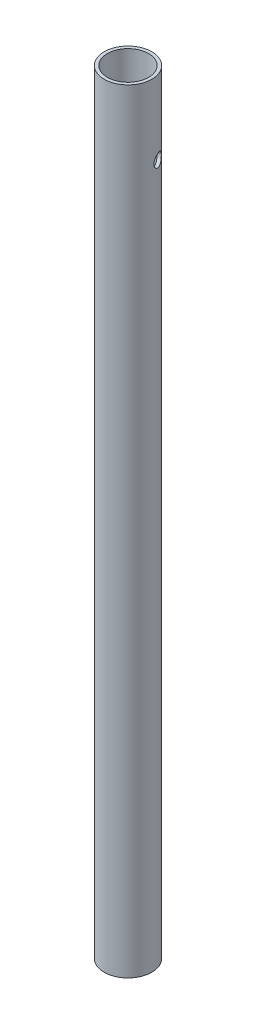
ISO-10303-21;
HEADER;
FILE_DESCRIPTION(('STEP AP214'),'2;1');
FILE_NAME('part.step','',(''),(''),'','','');
FILE_SCHEMA(('AUTOMOTIVE_DESIGN { 1 0 10303 214 1 1 1 1 }'));
ENDSEC;
DATA;
#1=APPLICATION_CONTEXT('core data for automotive mechanical design processes');
#2=APPLICATION_PROTOCOL_DEFINITION('international standard','automotive_design',2000,#1);
#3=PRODUCT_CONTEXT('',#1,'mechanical');
#4=PRODUCT('Part','Part','',(#3));
#5=PRODUCT_RELATED_PRODUCT_CATEGORY('part','',(#4));
#6=PRODUCT_DEFINITION_FORMATION('','',#4);
#7=PRODUCT_DEFINITION_CONTEXT('part definition',#1,'design');
#8=PRODUCT_DEFINITION('design','',#6,#7);
#9=PRODUCT_DEFINITION_SHAPE('','',#8);
#10=(LENGTH_UNIT() NAMED_UNIT(*) SI_UNIT(.MILLI.,.METRE.));
#11=(NAMED_UNIT(*) PLANE_ANGLE_UNIT() SI_UNIT($,.RADIAN.));
#12=(NAMED_UNIT(*) SI_UNIT($,.STERADIAN.) SOLID_ANGLE_UNIT());
#13=UNCERTAINTY_MEASURE_WITH_UNIT(LENGTH_MEASURE(1.E-05),#10,'distance_accuracy_value','');
#14=(GEOMETRIC_REPRESENTATION_CONTEXT(3) GLOBAL_UNCERTAINTY_ASSIGNED_CONTEXT((#13)) GLOBAL_UNIT_ASSIGNED_CONTEXT((#10,
#11,#12)) REPRESENTATION_CONTEXT('',''));
#15=CARTESIAN_POINT('',(0.,0.,0.));
#16=DIRECTION('',(0.,0.,1.));
#17=DIRECTION('',(1.,0.,0.));
#18=AXIS2_PLACEMENT_3D('',#15,#16,#17);
#19=CARTESIAN_POINT('',(0.,487.,0.));
#20=DIRECTION('',(0.,1.,0.));
#21=DIRECTION('',(0.,0.,1.));
#22=AXIS2_PLACEMENT_3D('',#19,#20,#21);
#23=PLANE('',#22);
#24=CARTESIAN_POINT('',(0.,487.,0.));
#25=DIRECTION('',(0.,1.,0.));
#26=DIRECTION('',(0.,0.,1.));
#27=AXIS2_PLACEMENT_3D('',#24,#25,#26);
#28=CIRCLE('',#27,15.);
#29=CARTESIAN_POINT('',(0.,487.,15.));
#30=VERTEX_POINT('',#29);
#31=EDGE_CURVE('E10',#30,#30,#28,.T.);
#32=ORIENTED_EDGE('',*,*,#31,.T.);
#33=EDGE_LOOP('',(#32));
#34=FACE_BOUND('',#33,.T.);
#35=CARTESIAN_POINT('',(0.,487.,0.));
#36=DIRECTION('',(0.,1.,0.));
#37=DIRECTION('',(0.,0.,1.));
#38=AXIS2_PLACEMENT_3D('',#35,#36,#37);
#39=CIRCLE('',#38,13.);
#40=CARTESIAN_POINT('',(0.,487.,13.));
#41=VERTEX_POINT('',#40);
#42=EDGE_CURVE('E47',#41,#41,#39,.T.);
#43=ORIENTED_EDGE('',*,*,#42,.F.);
#44=EDGE_LOOP('',(#43));
#45=FACE_BOUND('',#44,.T.);
#46=ADVANCED_FACE('F29',(#34,#45),#23,.T.);
#47=CARTESIAN_POINT('',(0.,0.,0.));
#48=DIRECTION('',(0.,1.,0.));
#49=DIRECTION('',(0.,0.,1.));
#50=AXIS2_PLACEMENT_3D('',#47,#48,#49);
#51=PLANE('',#50);
#52=CARTESIAN_POINT('',(0.,0.,0.));
#53=DIRECTION('',(0.,1.,0.));
#54=DIRECTION('',(0.,0.,1.));
#55=AXIS2_PLACEMENT_3D('',#52,#53,#54);
#56=CIRCLE('',#55,15.);
#57=CARTESIAN_POINT('',(0.,0.,15.));
#58=VERTEX_POINT('',#57);
#59=EDGE_CURVE('E42',#58,#58,#56,.T.);
#60=ORIENTED_EDGE('',*,*,#59,.F.);
#61=EDGE_LOOP('',(#60));
#62=FACE_BOUND('',#61,.T.);
#63=CARTESIAN_POINT('',(0.,0.,0.));
#64=DIRECTION('',(0.,1.,0.));
#65=DIRECTION('',(0.,0.,1.));
#66=AXIS2_PLACEMENT_3D('',#63,#64,#65);
#67=CIRCLE('',#66,13.);
#68=CARTESIAN_POINT('',(0.,0.,13.));
#69=VERTEX_POINT('',#68);
#70=EDGE_CURVE('E50',#69,#69,#67,.T.);
#71=ORIENTED_EDGE('',*,*,#70,.T.);
#72=EDGE_LOOP('',(#71));
#73=FACE_BOUND('',#72,.T.);
#74=ADVANCED_FACE('F83',(#62,#73),#51,.F.);
#75=CARTESIAN_POINT('',(0.,487.,0.));
#76=DIRECTION('',(0.,-1.,0.));
#77=DIRECTION('',(0.,0.,-1.));
#78=AXIS2_PLACEMENT_3D('',#75,#76,#77);
#79=CYLINDRICAL_SURFACE('',#78,15.);
#80=CARTESIAN_POINT('',(14.9376362524135,440.,-1.36639057029147));
#81=CARTESIAN_POINT('',(14.9376379475852,440.220351875481,-1.36639689069312));
#82=CARTESIAN_POINT('',(14.9359449105597,440.440760000953,-1.38528172759662));
#83=CARTESIAN_POINT('',(14.9288208500478,440.875210843114,-1.46002423433184));
#84=CARTESIAN_POINT('',(14.9233879511616,441.089250309958,-1.51590045340969));
#85=CARTESIAN_POINT('',(14.9077969595835,441.504616139895,-1.66221328734155));
#86=CARTESIAN_POINT('',(14.8976455068376,441.705959917659,-1.75260130540072));
#87=CARTESIAN_POINT('',(14.8711758142155,442.091033480122,-1.96455851840169));
#88=CARTESIAN_POINT('',(14.8548570952472,442.274761895017,-2.08613013554408));
#89=CARTESIAN_POINT('',(14.8139293232583,442.623985093979,-2.35944291881223));
#90=CARTESIAN_POINT('',(14.7891412658556,442.788974034932,-2.51180375023744));
#91=CARTESIAN_POINT('',(14.7296345610665,443.091563153906,-2.84000656767178));
#92=CARTESIAN_POINT('',(14.6949148849951,443.229160492288,-3.01585098502857));
#93=CARTESIAN_POINT('',(14.6134904616721,443.47516987681,-3.38863052127583));
#94=CARTESIAN_POINT('',(14.566602616199,443.58307903727,-3.58585839558687));
#95=CARTESIAN_POINT('',(14.4603485914372,443.763369270739,-3.99280267511343));
#96=CARTESIAN_POINT('',(14.4009845186843,443.835756334568,-4.20251696779378));
#97=CARTESIAN_POINT('',(14.2715240451911,443.941310440477,-4.62286003821469));
#98=CARTESIAN_POINT('',(14.2017046555378,443.975337953257,-4.83335781220347));
#99=CARTESIAN_POINT('',(14.0517497041047,444.00591424022,-5.25338183741455));
#100=CARTESIAN_POINT('',(13.9716158711744,444.002469287266,-5.46290824536806));
#101=CARTESIAN_POINT('',(13.805642100927,443.958804374926,-5.86952171559844));
#102=CARTESIAN_POINT('',(13.7199970438229,443.919514084733,-6.06678922986318));
#103=CARTESIAN_POINT('',(13.5444164968208,443.806775724441,-6.44927062511435));
#104=CARTESIAN_POINT('',(13.4544807625407,443.733325706633,-6.63448381810409));
#105=CARTESIAN_POINT('',(13.2731598803016,443.55364030482,-6.99024481586594));
#106=CARTESIAN_POINT('',(13.1817692101257,443.447086385804,-7.16062860223872));
#107=CARTESIAN_POINT('',(13.0025882296117,443.204462360986,-7.48107298927626));
#108=CARTESIAN_POINT('',(12.9147986250204,443.068386501946,-7.63112961931111));
#109=CARTESIAN_POINT('',(12.7445425339747,442.765646284138,-7.91230109278182));
#110=CARTESIAN_POINT('',(12.6623222074221,442.598171109913,-8.04269299820274));
#111=CARTESIAN_POINT('',(12.5109005937783,442.239950647518,-8.27627920651759));
#112=CARTESIAN_POINT('',(12.4417001005501,442.049203941572,-8.37947185113501));
#113=CARTESIAN_POINT('',(12.3202266272456,441.648199796383,-8.55708582270042));
#114=CARTESIAN_POINT('',(12.2680606612589,441.437829298274,-8.63132580872717));
#115=CARTESIAN_POINT('',(12.1848677135477,441.004547001194,-8.74838344854573));
#116=CARTESIAN_POINT('',(12.1538354896785,440.781638327132,-8.79120889479843));
#117=CARTESIAN_POINT('',(12.1157874629629,440.336745577922,-8.84356930622375));
#118=CARTESIAN_POINT('',(12.1080817359527,440.114932902752,-8.85406078286354));
#119=CARTESIAN_POINT('',(12.11528800144,439.672380454389,-8.84419784800806));
#120=CARTESIAN_POINT('',(12.130197586869,439.451640569521,-8.82384671925615));
#121=CARTESIAN_POINT('',(12.1810460040586,439.021886811815,-8.75350909669322));
#122=CARTESIAN_POINT('',(12.2165752521451,438.812729124124,-8.70409956298651));
#123=CARTESIAN_POINT('',(12.3059745159262,438.407240737279,-8.57723582875527));
#124=CARTESIAN_POINT('',(12.3598469266703,438.210911717143,-8.49977796590275));
#125=CARTESIAN_POINT('',(12.4839946638457,437.831890085127,-8.31639100352773));
#126=CARTESIAN_POINT('',(12.554604497085,437.649592048218,-8.20987353201583));
#127=CARTESIAN_POINT('',(12.7074580086047,437.308073396591,-7.9712326709441));
#128=CARTESIAN_POINT('',(12.7897038731658,437.148857130088,-7.83910446768276));
#129=CARTESIAN_POINT('',(12.9639603774017,436.853295053496,-7.54753902088796));
#130=CARTESIAN_POINT('',(13.0561845370422,436.717743246039,-7.38742285953389));
#131=CARTESIAN_POINT('',(13.2435406955314,436.479178025175,-7.04602623300473));
#132=CARTESIAN_POINT('',(13.338672539308,436.376162879838,-6.86474689505173));
#133=CARTESIAN_POINT('',(13.5265215292037,436.206540735272,-6.48670811671682));
#134=CARTESIAN_POINT('',(13.6192515605767,436.139661961108,-6.29007733151613));
#135=CARTESIAN_POINT('',(13.7989692656451,436.043422543866,-5.88535558715236));
#136=CARTESIAN_POINT('',(13.8859582078421,436.014053586445,-5.67726717833139));
#137=CARTESIAN_POINT('',(14.0483921733182,435.994188352512,-5.26220791809684));
#138=CARTESIAN_POINT('',(14.1241094417985,436.002527361732,-5.05539856546836));
#139=CARTESIAN_POINT('',(14.2650608269379,436.055136987145,-4.64279773353804));
#140=CARTESIAN_POINT('',(14.3302953370931,436.099406254229,-4.43700621631044));
#141=CARTESIAN_POINT('',(14.4489106573758,436.221961209832,-4.03396207603864));
#142=CARTESIAN_POINT('',(14.5023699910164,436.30001058694,-3.83666041626762));
#143=CARTESIAN_POINT('',(14.5980585733438,436.487699203487,-3.45477684897772));
#144=CARTESIAN_POINT('',(14.6402862454788,436.597342873221,-3.27019672983145));
#145=CARTESIAN_POINT('',(14.7153195074144,436.848516544269,-2.91433523419844));
#146=CARTESIAN_POINT('',(14.7478438658137,436.990818761393,-2.7435396433636));
#147=CARTESIAN_POINT('',(14.8033866532686,437.301805498726,-2.42606138943716));
#148=CARTESIAN_POINT('',(14.8264025785683,437.470496951635,-2.27938508353642));
#149=CARTESIAN_POINT('',(14.8650801483114,437.833936791632,-2.01198580386249));
#150=CARTESIAN_POINT('',(14.8805689294883,438.029176627311,-1.89190452120568));
#151=CARTESIAN_POINT('',(14.9052596257943,438.437412621718,-1.68642150836445));
#152=CARTESIAN_POINT('',(14.9144656553813,438.650397057076,-1.60099709693151));
#153=CARTESIAN_POINT('',(14.9269966197292,439.052162672101,-1.47914210506031));
#154=CARTESIAN_POINT('',(14.9310373313106,439.239202529112,-1.43698230416531));
#155=CARTESIAN_POINT('',(14.9363562543976,439.617481115987,-1.38060538653264));
#156=CARTESIAN_POINT('',(14.9376347808875,439.808719364577,-1.36638508374664));
#157=CARTESIAN_POINT('',(14.9376362524135,440.,-1.36639057029147));
#158=B_SPLINE_CURVE_WITH_KNOTS('',3,(#80,#81,#82,#83,#84,#85,#86,#87,#88,#89,#90,#91,#92,#93,
#94,#95,#96,#97,#98,#99,#100,#101,#102,#103,#104,#105,#106,#107,#108,#109,#110,#111,#112,#113,
#114,#115,#116,#117,#118,#119,#120,#121,#122,#123,#124,#125,#126,#127,#128,#129,#130,#131,#132,
#133,#134,#135,#136,#137,#138,#139,#140,#141,#142,#143,#144,#145,#146,#147,#148,#149,#150,#151,
#152,#153,#154,#155,#156,#157),.UNSPECIFIED.,.T.,.F.,(4,2,2,2,2,2,2,2,2,2,2,2,2,2,2,2,2,2,2,2,2,
2,2,2,2,2,2,2,2,2,2,2,2,2,2,2,2,2,4),(0.,0.660352256232896,1.32103589570211,1.98079262319479,
2.64060061312546,3.31531832260848,3.99010594249442,4.67570414742218,5.36118668609198,
6.03096608633756,6.7006333677209,7.35341141602572,8.00622668882437,8.66552897812272,
9.32495986790195,10.0046352460197,10.6843520528055,11.3682603019684,12.0519988484352,
12.7153066849063,13.3785439269368,14.029037008719,14.6796150573648,15.3444926994246,
16.0094954308996,16.6937181392637,17.377904420234,18.0568707919009,18.7356866392539,
19.3936810984039,20.0516508523347,20.7050902974496,21.3586214153964,22.0295770799096,
22.7007093076998,23.3866007797913,24.0720426421069,24.6453393535126,25.218570685896),.UNSPECIFIED.);
#159=CARTESIAN_POINT('',(14.9376362524135,440.,-1.36639057029147));
#160=VERTEX_POINT('',#159);
#161=EDGE_CURVE('E73',#160,#160,#158,.T.);
#162=ORIENTED_EDGE('',*,*,#161,.T.);
#163=EDGE_LOOP('',(#162));
#164=FACE_BOUND('',#163,.T.);
#165=CARTESIAN_POINT('',(-12.1108193872136,440.,8.85031376677065));
#166=CARTESIAN_POINT('',(-12.1108248375872,439.779648124519,8.85031014537423));
#167=CARTESIAN_POINT('',(-12.1220396271537,439.559239999047,8.83502185134835));
#168=CARTESIAN_POINT('',(-12.1661079475013,439.124789156886,8.77423387808899));
#169=CARTESIAN_POINT('',(-12.1989723343839,438.910749690042,8.72871904178727));
#170=CARTESIAN_POINT('',(-12.2840042645092,438.495383860104,8.60863534076694));
#171=CARTESIAN_POINT('',(-12.3361446615305,438.294040082341,8.53410732724197));
#172=CARTESIAN_POINT('',(-12.4564129543661,437.908966519878,8.35757958860284));
#173=CARTESIAN_POINT('',(-12.5245420920784,437.725238104983,8.25557772941411));
#174=CARTESIAN_POINT('',(-12.6745257994071,437.376014906021,8.02345739951234));
#175=CARTESIAN_POINT('',(-12.7566557348272,437.211025965068,7.89275566099956));
#176=CARTESIAN_POINT('',(-12.9289885809186,436.908436846094,7.60716937378548));
#177=CARTESIAN_POINT('',(-13.0191923271838,436.770839507712,7.45228232080244));
#178=CARTESIAN_POINT('',(-13.2045509850221,436.52483012319,7.11876067634352));
#179=CARTESIAN_POINT('',(-13.2997620658265,436.41692096273,6.93978538600869));
#180=CARTESIAN_POINT('',(-13.4890782812772,436.236630729261,6.56421523945164));
#181=CARTESIAN_POINT('',(-13.5831835997961,436.164243665432,6.36762336089437));
#182=CARTESIAN_POINT('',(-13.7639465164872,436.058689559523,5.96665817662357));
#183=CARTESIAN_POINT('',(-13.8507253432585,436.024662046743,5.76256629719182));
#184=CARTESIAN_POINT('',(-14.0159006436947,435.99408575978,5.34829128063925));
#185=CARTESIAN_POINT('',(-14.0942985181063,435.997530712734,5.13810916889388));
#186=CARTESIAN_POINT('',(-14.2385892266853,436.041195625074,4.72330560333457));
#187=CARTESIAN_POINT('',(-14.3047475759883,436.080485915267,4.51867759741149));
#188=CARTESIAN_POINT('',(-14.4258763911663,436.193224275559,4.1156287711728));
#189=CARTESIAN_POINT('',(-14.4808462188401,436.266674293367,3.9172083054857));
#190=CARTESIAN_POINT('',(-14.5800028931878,436.44635969518,3.53041235954421));
#191=CARTESIAN_POINT('',(-14.6240771616019,436.552913614196,3.34215628894439));
#192=CARTESIAN_POINT('',(-14.701491029766,436.795537639014,2.98327257243208));
#193=CARTESIAN_POINT('',(-14.7348285339839,436.931613498054,2.81264837220177));
#194=CARTESIAN_POINT('',(-14.7929746964199,437.234353715862,2.48913089535423));
#195=CARTESIAN_POINT('',(-14.8174900994426,437.401828890087,2.33694276798435));
#196=CARTESIAN_POINT('',(-14.8583081467238,437.760049352482,2.0615795373061));
#197=CARTESIAN_POINT('',(-14.8746102902939,437.950796058428,1.93840620301174));
#198=CARTESIAN_POINT('',(-14.9008938794914,438.351800203617,1.72483724330369));
#199=CARTESIAN_POINT('',(-14.9108357289346,438.562170701726,1.63464842380687));
#200=CARTESIAN_POINT('',(-14.9258059061716,438.995452998806,1.49182177579514));
#201=CARTESIAN_POINT('',(-14.9308354525781,439.218361672868,1.43917463505652));
#202=CARTESIAN_POINT('',(-14.9369048589176,439.663254422078,1.37473530445581));
#203=CARTESIAN_POINT('',(-14.9380594434803,439.885067097248,1.36176933957359));
#204=CARTESIAN_POINT('',(-14.9369456590487,440.327619545611,1.37393351774051));
#205=CARTESIAN_POINT('',(-14.934677654339,440.548359430479,1.39905960644886));
#206=CARTESIAN_POINT('',(-14.9263271794152,440.978113188185,1.48544949154566));
#207=CARTESIAN_POINT('',(-14.9203188418732,441.187270875876,1.54600962175266));
#208=CARTESIAN_POINT('',(-14.9035222116504,441.592759262721,1.70029671985504));
#209=CARTESIAN_POINT('',(-14.8927332947186,441.789088282857,1.79402801894184));
#210=CARTESIAN_POINT('',(-14.8646395535788,442.168109914873,2.01369636059282));
#211=CARTESIAN_POINT('',(-14.8471967231159,442.350407951782,2.1402959970568));
#212=CARTESIAN_POINT('',(-14.8041112999182,442.691926603409,2.42039830491026));
#213=CARTESIAN_POINT('',(-14.7784671651058,442.851142869912,2.57390603332868));
#214=CARTESIAN_POINT('',(-14.7164508392066,443.146704946504,2.90786668124263));
#215=CARTESIAN_POINT('',(-14.6797900060952,443.282256753961,3.08897014356113));
#216=CARTESIAN_POINT('',(-14.5946580078523,443.520821974825,3.46897873504889));
#217=CARTESIAN_POINT('',(-14.5461874715961,443.623837120162,3.66788291596031));
#218=CARTESIAN_POINT('',(-14.4372005606101,443.793459264728,4.07570936699493));
#219=CARTESIAN_POINT('',(-14.376778909359,443.860338038892,4.28454362775495));
#220=CARTESIAN_POINT('',(-14.2440507114451,443.956577456134,4.7070141821779));
#221=CARTESIAN_POINT('',(-14.171746802589,443.985946413555,4.92064940098401));
#222=CARTESIAN_POINT('',(-14.0192165945501,444.005811647488,5.33944949444427));
#223=CARTESIAN_POINT('',(-13.9393013260133,443.997472638268,5.54467318443989));
#224=CARTESIAN_POINT('',(-13.7722783731614,443.944863012855,5.94742630075674));
#225=CARTESIAN_POINT('',(-13.6851709590073,443.900593745771,6.14495601567936));
#226=CARTESIAN_POINT('',(-13.5077076735181,443.778038790168,6.52577218591982));
#227=CARTESIAN_POINT('',(-13.4173782982478,443.69998941306,6.70914734581056));
#228=CARTESIAN_POINT('',(-13.2367030073198,443.512300796513,7.05892985395241));
#229=CARTESIAN_POINT('',(-13.1463570911196,443.402657126779,7.22533481813297));
#230=CARTESIAN_POINT('',(-12.9673880140583,443.151483455731,7.54193782495176));
#231=CARTESIAN_POINT('',(-12.8788750098006,443.009181238607,7.69158546380779));
#232=CARTESIAN_POINT('',(-12.7106582675827,442.698194501274,7.96650467119797));
#233=CARTESIAN_POINT('',(-12.6309568539274,442.529503048365,8.09176981475926));
#234=CARTESIAN_POINT('',(-12.4831943605482,442.166063208368,8.31796569164861));
#235=CARTESIAN_POINT('',(-12.4154278158105,441.970823372689,8.41830069152976));
#236=CARTESIAN_POINT('',(-12.2981049603805,441.562587378282,8.58879481648468));
#237=CARTESIAN_POINT('',(-12.2485367417887,441.349602942924,8.65897367907915));
#238=CARTESIAN_POINT('',(-12.177378366923,440.947837327899,8.75868400852348));
#239=CARTESIAN_POINT('',(-12.1525375733193,440.760797470888,8.79298723191032));
#240=CARTESIAN_POINT('',(-12.1192566528227,440.382518884013,8.83880238350306));
#241=CARTESIAN_POINT('',(-12.1108146559132,440.191280635423,8.85031691039269));
#242=CARTESIAN_POINT('',(-12.1108193872136,440.,8.85031376677065));
#243=B_SPLINE_CURVE_WITH_KNOTS('',3,(#165,#166,#167,#168,#169,#170,#171,#172,#173,#174,#175,
#176,#177,#178,#179,#180,#181,#182,#183,#184,#185,#186,#187,#188,#189,#190,#191,#192,#193,#194,
#195,#196,#197,#198,#199,#200,#201,#202,#203,#204,#205,#206,#207,#208,#209,#210,#211,#212,#213,
#214,#215,#216,#217,#218,#219,#220,#221,#222,#223,#224,#225,#226,#227,#228,#229,#230,#231,#232,
#233,#234,#235,#236,#237,#238,#239,#240,#241,#242),.UNSPECIFIED.,.T.,.F.,(4,2,2,2,2,2,2,2,2,2,2,
2,2,2,2,2,2,2,2,2,2,2,2,2,2,2,2,2,2,2,2,2,2,2,2,2,2,2,4),(0.,0.660352256232896,1.32103589570211,
1.98079262319486,2.64060061312546,3.31531832260847,3.99010594249441,4.67570414742216,
5.36118668609196,6.03096608633755,6.70063336772089,7.35341141602571,8.00622668882437,
8.66552897812274,9.32495986790197,10.0046352460196,10.6843520528056,11.3682603019685,
12.0519988484352,12.7153066849063,13.3785439269369,14.029037008719,14.6796150573648,
15.3444926994247,16.0094954308995,16.6937181392637,17.377904420234,18.0568707919009,
18.7356866392539,19.3936810984039,20.0516508523347,20.7050902974496,21.3586214153964,
22.0295770799095,22.7007093076998,23.3866007797913,24.0720426421069,24.6453393535126,
25.218570685896),.UNSPECIFIED.);
#244=CARTESIAN_POINT('',(-12.1108193872136,440.,8.85031376677065));
#245=VERTEX_POINT('',#244);
#246=EDGE_CURVE('E69',#245,#245,#243,.T.);
#247=ORIENTED_EDGE('',*,*,#246,.T.);
#248=EDGE_LOOP('',(#247));
#249=FACE_BOUND('',#248,.T.);
#250=ORIENTED_EDGE('',*,*,#31,.F.);
#251=EDGE_LOOP('',(#250));
#252=FACE_BOUND('',#251,.T.);
#253=ORIENTED_EDGE('',*,*,#59,.T.);
#254=EDGE_LOOP('',(#253));
#255=FACE_BOUND('',#254,.T.);
#256=ADVANCED_FACE('F31',(#164,#249,#252,#255),#79,.T.);
#257=CARTESIAN_POINT('',(0.,487.,0.));
#258=DIRECTION('',(0.,-1.,0.));
#259=DIRECTION('',(0.,0.,-1.));
#260=AXIS2_PLACEMENT_3D('',#257,#258,#259);
#261=CYLINDRICAL_SURFACE('',#260,13.);
#262=CARTESIAN_POINT('',(12.9847856199924,440.,-0.628762596564893));
#263=CARTESIAN_POINT('',(12.9847865357193,440.218895633333,-0.628765059934831));
#264=CARTESIAN_POINT('',(12.9839101572565,440.437810969678,-0.647704465699338));
#265=CARTESIAN_POINT('',(12.9799559600609,440.869222363371,-0.722571498832685));
#266=CARTESIAN_POINT('',(12.9768774922975,441.081716508927,-0.778510030737926));
#267=CARTESIAN_POINT('',(12.9672712468072,441.49397561595,-0.924765162043783));
#268=CARTESIAN_POINT('',(12.9607494221174,441.693761881519,-1.01502235460628));
#269=CARTESIAN_POINT('',(12.9424556772616,442.0759997018,-1.2263980821186));
#270=CARTESIAN_POINT('',(12.930682883656,442.258448366471,-1.34752174992253));
#271=CARTESIAN_POINT('',(12.8993455064339,442.606907138947,-1.62058325015506));
#272=CARTESIAN_POINT('',(12.8795564628196,442.772254846988,-1.7733408197187));
#273=CARTESIAN_POINT('',(12.8299568704235,443.075907436171,-2.10234288247162));
#274=CARTESIAN_POINT('',(12.8001449677861,443.214208659968,-2.27859054668521));
#275=CARTESIAN_POINT('',(12.7278092618534,443.462747276003,-2.65330232558785));
#276=CARTESIAN_POINT('',(12.6850218328135,443.57230513571,-2.85216785689052));
#277=CARTESIAN_POINT('',(12.5857232504792,443.755777884024,-3.26252289425673));
#278=CARTESIAN_POINT('',(12.529215223441,443.829700880642,-3.47400951632088));
#279=CARTESIAN_POINT('',(12.4042777845987,443.93760142923,-3.89626673629182));
#280=CARTESIAN_POINT('',(12.3362567592854,443.972710553449,-4.1068685647495));
#281=CARTESIAN_POINT('',(12.1884129705305,444.005569212859,-4.52681979322199));
#282=CARTESIAN_POINT('',(12.1085928142587,444.003326989117,-4.73616945931253));
#283=CARTESIAN_POINT('',(11.9424933856763,443.962296890549,-5.14033318257637));
#284=CARTESIAN_POINT('',(11.8565198722113,443.924735190602,-5.33539923131212));
#285=CARTESIAN_POINT('',(11.679105690288,443.816140819171,-5.71332600693837));
#286=CARTESIAN_POINT('',(11.5876646694081,443.745105988059,-5.8961859454429));
#287=CARTESIAN_POINT('',(11.4020673206389,443.570777513168,-6.2476285119374));
#288=CARTESIAN_POINT('',(11.3078915685701,443.467106521841,-6.41601319268988));
#289=CARTESIAN_POINT('',(11.1222385741349,443.230749615193,-6.73272293711116));
#290=CARTESIAN_POINT('',(11.030762004363,443.098056536164,-6.88104303345486));
#291=CARTESIAN_POINT('',(10.8514667024599,442.801101778667,-7.1606133017155));
#292=CARTESIAN_POINT('',(10.7639457278772,442.635780029855,-7.29092998799221));
#293=CARTESIAN_POINT('',(10.601790685472,442.281512121346,-7.52478152141271));
#294=CARTESIAN_POINT('',(10.5271580409026,442.092563356494,-7.62831341135024));
#295=CARTESIAN_POINT('',(10.3949127917656,441.693713863552,-7.80758483264644));
#296=CARTESIAN_POINT('',(10.3374880029466,441.483613170598,-7.88301971585709));
#297=CARTESIAN_POINT('',(10.2450268694745,441.050062565505,-8.00282560250831));
#298=CARTESIAN_POINT('',(10.2099827714318,440.82661730572,-8.04720736425678));
#299=CARTESIAN_POINT('',(10.1660075802126,440.382070943657,-8.1026848488532));
#300=CARTESIAN_POINT('',(10.1561102048861,440.161219039526,-8.11501272404822));
#301=CARTESIAN_POINT('',(10.1604043369788,439.720137228088,-8.10963632819492));
#302=CARTESIAN_POINT('',(10.174592260326,439.499907233121,-8.0919365254892));
#303=CARTESIAN_POINT('',(10.2251978677875,439.072674790519,-8.02788254583139));
#304=CARTESIAN_POINT('',(10.2609875461418,438.865474860405,-7.98233742078781));
#305=CARTESIAN_POINT('',(10.3517092387452,438.463306235823,-7.86432567590884));
#306=CARTESIAN_POINT('',(10.406644311291,438.268339501367,-7.79185475480857));
#307=CARTESIAN_POINT('',(10.5338868243481,437.890138176735,-7.61899084416436));
#308=CARTESIAN_POINT('',(10.6066372149478,437.707384295718,-7.51787353347473));
#309=CARTESIAN_POINT('',(10.7642385187518,437.364112908895,-7.29042381499363));
#310=CARTESIAN_POINT('',(10.8490924782512,437.203601021191,-7.16408505611645));
#311=CARTESIAN_POINT('',(11.0298176271335,436.902750842723,-6.88274132160719));
#312=CARTESIAN_POINT('',(11.1259937124394,436.763476104594,-6.72679195752656));
#313=CARTESIAN_POINT('',(11.3211864223107,436.517051927709,-6.39281565890872));
#314=CARTESIAN_POINT('',(11.4202029117726,436.409900963757,-6.21478977310453));
#315=CARTESIAN_POINT('',(11.6153062257859,436.231797793996,-5.84196443282183));
#316=CARTESIAN_POINT('',(11.7114094701682,436.160579716791,-5.64730102340928));
#317=CARTESIAN_POINT('',(11.896960614627,436.055716468484,-5.24512120452848));
#318=CARTESIAN_POINT('',(11.9864105199077,436.022059933792,-5.03760870239292));
#319=CARTESIAN_POINT('',(12.1516392807925,435.994175498761,-4.62441144911146));
#320=CARTESIAN_POINT('',(12.2278245549821,435.998409017627,-4.41899179337117));
#321=CARTESIAN_POINT('',(12.3686250684546,436.042480395005,-4.00802819731529));
#322=CARTESIAN_POINT('',(12.4332410229329,436.082316051741,-3.80248426547096));
#323=CARTESIAN_POINT('',(12.5492818655035,436.195491624482,-3.3998455759463));
#324=CARTESIAN_POINT('',(12.6008534619116,436.268430493348,-3.20267972226464));
#325=CARTESIAN_POINT('',(12.6920093488492,436.445381267962,-2.81986881287942));
#326=CARTESIAN_POINT('',(12.7315916125904,436.549398421575,-2.6342257093015));
#327=CARTESIAN_POINT('',(12.8009728421308,436.789549472631,-2.27374639582321));
#328=CARTESIAN_POINT('',(12.8304035340174,436.926634667593,-2.0994732984794));
#329=CARTESIAN_POINT('',(12.8794584377938,437.227338979039,-1.77389699399997));
#330=CARTESIAN_POINT('',(12.8990797516012,437.390965918127,-1.62260058427698));
#331=CARTESIAN_POINT('',(12.9311899561883,437.746353952262,-1.34340494148787));
#332=CARTESIAN_POINT('',(12.9434319752111,437.938844710166,-1.21640359795819));
#333=CARTESIAN_POINT('',(12.9621957814591,438.342781506824,-0.996840733054924));
#334=CARTESIAN_POINT('',(12.9687200557352,438.554219260036,-0.90426424797802));
#335=CARTESIAN_POINT('',(12.9776762285199,438.969576396424,-0.764437547311014));
#336=CARTESIAN_POINT('',(12.9804353058348,439.172332622421,-0.713743265554671));
#337=CARTESIAN_POINT('',(12.9839893422483,439.583387466025,-0.645908437612331));
#338=CARTESIAN_POINT('',(12.9847847485276,439.791684810846,-0.628760252263333));
#339=CARTESIAN_POINT('',(12.9847856199924,440.,-0.628762596564893));
#340=B_SPLINE_CURVE_WITH_KNOTS('',3,(#262,#263,#264,#265,#266,#267,#268,#269,#270,#271,#272,
#273,#274,#275,#276,#277,#278,#279,#280,#281,#282,#283,#284,#285,#286,#287,#288,#289,#290,#291,
#292,#293,#294,#295,#296,#297,#298,#299,#300,#301,#302,#303,#304,#305,#306,#307,#308,#309,#310,
#311,#312,#313,#314,#315,#316,#317,#318,#319,#320,#321,#322,#323,#324,#325,#326,#327,#328,#329,
#330,#331,#332,#333,#334,#335,#336,#337,#338,#339),.UNSPECIFIED.,.T.,.F.,(4,2,2,2,2,2,2,2,2,2,2,
2,2,2,2,2,2,2,2,2,2,2,2,2,2,2,2,2,2,2,2,2,2,2,2,2,2,2,4),(0.,0.655917809649885,1.3120290203163,
1.967009611655,2.62209919231317,3.29696185742468,3.97191571746745,4.66162344768767,
5.35117417432776,6.02004343553606,6.68876512178488,7.33509594401607,7.98146847208715,
8.63560743090418,9.28990803760375,9.97068242960502,10.6515319512413,11.3395625139908,
12.0273545913861,12.6882881485736,13.3491233625412,13.9916145334807,14.6342083834176,
15.2947765635335,15.9555112935248,16.6426712045207,17.3297984848591,18.0117642066852,
18.6935235556845,19.3477287428133,20.0018934741331,20.6483362097528,21.2948881651586,
21.9628972721022,22.6311036191777,23.320576376814,24.0097490850114,24.6341049322677,
25.2583185837973),.UNSPECIFIED.);
#341=CARTESIAN_POINT('',(12.9847856199924,440.,-0.628762596564893));
#342=VERTEX_POINT('',#341);
#343=EDGE_CURVE('E34',#342,#342,#340,.T.);
#344=ORIENTED_EDGE('',*,*,#343,.F.);
#345=EDGE_LOOP('',(#344));
#346=FACE_BOUND('',#345,.T.);
#347=CARTESIAN_POINT('',(-10.1579687547925,440.,8.11268579304407));
#348=CARTESIAN_POINT('',(-10.1579710704191,439.781104366667,8.11268455021642));
#349=CARTESIAN_POINT('',(-10.1698346626016,439.562189030323,8.09789521924941));
#350=CARTESIAN_POINT('',(-10.2163636087722,439.130777636629,8.03910945997135));
#351=CARTESIAN_POINT('',(-10.2510356849554,438.918283491073,7.99510442107087));
#352=CARTESIAN_POINT('',(-10.3405197296855,438.50602438405,7.8790206189086));
#353=CARTESIAN_POINT('',(-10.3952968899519,438.306238118481,7.8069903633232));
#354=CARTESIAN_POINT('',(-10.521315041501,437.9240002982,7.6363041460637));
#355=CARTESIAN_POINT('',(-10.5925587708622,437.741551633529,7.53764375584423));
#356=CARTESIAN_POINT('',(-10.7495718764693,437.393092861053,7.31205231365719));
#357=CARTESIAN_POINT('',(-10.8357147843649,437.227745153012,7.18435783168771));
#358=CARTESIAN_POINT('',(-11.0160091771475,436.924092563829,6.90472162374477));
#359=CARTESIAN_POINT('',(-11.1101617426692,436.785791340032,6.7527766235464));
#360=CARTESIAN_POINT('',(-11.3036169595967,436.537252723997,6.42381393471272));
#361=CARTESIAN_POINT('',(-11.4029871992212,436.42769486429,6.2463207824473));
#362=CARTESIAN_POINT('',(-11.599776879042,436.244222115976,5.8727899442807));
#363=CARTESIAN_POINT('',(-11.6971967581649,436.170299119358,5.67675648901468));
#364=CARTESIAN_POINT('',(-11.8826187109865,436.06239857077,5.27734539395862));
#365=CARTESIAN_POINT('',(-11.9708156147541,436.027289446551,5.07436436972188));
#366=CARTESIAN_POINT('',(-12.1375267609673,435.994430787141,4.66153969277383));
#367=CARTESIAN_POINT('',(-12.2160431354388,435.996673010883,4.45169756406913));
#368=CARTESIAN_POINT('',(-12.3586200000179,436.037703109451,4.03864893126099));
#369=CARTESIAN_POINT('',(-12.4230764916752,436.075264809398,3.83545550353726));
#370=CARTESIAN_POINT('',(-12.5398184314576,436.183859180829,3.43461169458092));
#371=CARTESIAN_POINT('',(-12.5921030939524,436.254894011941,3.23696167187095));
#372=CARTESIAN_POINT('',(-12.6851962216966,436.429222486832,2.8505785420876));
#373=CARTESIAN_POINT('',(-12.7258592473939,436.532893478159,2.66198111015656));
#374=CARTESIAN_POINT('',(-12.7959482350521,436.769250384807,2.30162069284743));
#375=CARTESIAN_POINT('',(-12.8253714176772,436.901943463836,2.12986187903909));
#376=CARTESIAN_POINT('',(-12.8756770188358,437.198898221333,1.80156980378918));
#377=CARTESIAN_POINT('',(-12.896165698897,437.364219970145,1.64593377420925));
#378=CARTESIAN_POINT('',(-12.9291060305478,437.718487878654,1.36327544333734));
#379=CARTESIAN_POINT('',(-12.9415567949288,437.907436643506,1.23625630172556));
#380=CARTESIAN_POINT('',(-12.9608542517651,438.306286136448,1.01432240036637));
#381=CARTESIAN_POINT('',(-12.9676404520161,438.516386829402,0.919760381235718));
#382=CARTESIAN_POINT('',(-12.9774737596668,438.949937434495,0.768744429297286));
#383=CARTESIAN_POINT('',(-12.9805221622967,439.17338269428,0.712277298814728));
#384=CARTESIAN_POINT('',(-12.9842052523934,439.617929056343,0.64158073887547));
#385=CARTESIAN_POINT('',(-12.9849295476785,439.838780960474,0.625788020885281));
#386=CARTESIAN_POINT('',(-12.9845969527555,440.279862771912,0.6326607629449));
#387=CARTESIAN_POINT('',(-12.9835403275619,440.500092766879,0.655320500982386));
#388=CARTESIAN_POINT('',(-12.9791618868843,440.927325209481,0.736835340574827));
#389=CARTESIAN_POINT('',(-12.9759037647258,441.134525139595,0.794668238928079));
#390=CARTESIAN_POINT('',(-12.9659515154768,441.536693764177,0.943188103502139));
#391=CARTESIAN_POINT('',(-12.9592568393482,441.731660498633,1.03388031878144));
#392=CARTESIAN_POINT('',(-12.9404420082635,442.109861823265,1.24769937982037));
#393=CARTESIAN_POINT('',(-12.928175332345,442.292615704282,1.37166251351508));
#394=CARTESIAN_POINT('',(-12.8960507368071,442.635887091105,1.64650711644442));
#395=CARTESIAN_POINT('',(-12.876190903978,442.796398978809,1.79739536475205));
#396=CARTESIAN_POINT('',(-12.8257856297969,443.097249157277,2.12796333767272));
#397=CARTESIAN_POINT('',(-12.7948445977748,443.236523895406,2.30855319364286));
#398=CARTESIAN_POINT('',(-12.7204979333165,443.482948072291,2.68817528929759));
#399=CARTESIAN_POINT('',(-12.6770928928475,443.590099036243,2.88720665281505));
#400=CARTESIAN_POINT('',(-12.5769954714998,443.768202206004,3.29591748425389));
#401=CARTESIAN_POINT('',(-12.520405351602,443.839420283209,3.50550573505737));
#402=CARTESIAN_POINT('',(-12.3937343983742,443.944283531516,3.92992569633787));
#403=CARTESIAN_POINT('',(-12.3236576527141,443.977940066208,4.14475580087393));
#404=CARTESIAN_POINT('',(-12.1744553373064,444.005824501239,4.56400654043183));
#405=CARTESIAN_POINT('',(-12.0958099557061,444.001590982373,4.76849696788689));
#406=CARTESIAN_POINT('',(-11.9297562073808,443.957519604995,5.16992194785752));
#407=CARTESIAN_POINT('',(-11.8423483828563,443.917683948259,5.36685696684363));
#408=CARTESIAN_POINT('',(-11.6632215560248,443.804508375518,5.7456669077849));
#409=CARTESIAN_POINT('',(-11.5715656240707,443.731569506652,5.92769216304285));
#410=CARTESIAN_POINT('',(-11.3868764419288,443.554618732038,6.27517380869837));
#411=CARTESIAN_POINT('',(-11.2938429616524,443.450601578425,6.44062739450593));
#412=CARTESIAN_POINT('',(-11.1075803431763,443.210450527369,6.7569584353741));
#413=CARTESIAN_POINT('',(-11.0144471769036,443.073365332407,6.90716992435797));
#414=CARTESIAN_POINT('',(-10.8360089328654,442.772661020961,7.1838757368874));
#415=CARTESIAN_POINT('',(-10.750706174585,442.609034081873,7.31036304447339));
#416=CARTESIAN_POINT('',(-10.5902175357138,442.253646047738,7.54106776697442));
#417=CARTESIAN_POINT('',(-10.5154400393011,442.061155289834,7.64444829859594));
#418=CARTESIAN_POINT('',(-10.3843619281487,441.657218493176,7.82158796339792));
#419=CARTESIAN_POINT('',(-10.3280532866759,441.445780739964,7.8953599678408));
#420=CARTESIAN_POINT('',(-10.2423314344059,441.030423603576,8.00619084482812));
#421=CARTESIAN_POINT('',(-10.2108867769836,440.827667377579,8.04605004991321));
#422=CARTESIAN_POINT('',(-10.1687066927534,440.416612533975,8.09929510180661));
#423=CARTESIAN_POINT('',(-10.157966551093,440.208315189154,8.11268697579895));
#424=CARTESIAN_POINT('',(-10.1579687547925,440.,8.11268579304407));
#425=B_SPLINE_CURVE_WITH_KNOTS('',3,(#347,#348,#349,#350,#351,#352,#353,#354,#355,#356,#357,
#358,#359,#360,#361,#362,#363,#364,#365,#366,#367,#368,#369,#370,#371,#372,#373,#374,#375,#376,
#377,#378,#379,#380,#381,#382,#383,#384,#385,#386,#387,#388,#389,#390,#391,#392,#393,#394,#395,
#396,#397,#398,#399,#400,#401,#402,#403,#404,#405,#406,#407,#408,#409,#410,#411,#412,#413,#414,
#415,#416,#417,#418,#419,#420,#421,#422,#423,#424),.UNSPECIFIED.,.T.,.F.,(4,2,2,2,2,2,2,2,2,2,2,
2,2,2,2,2,2,2,2,2,2,2,2,2,2,2,2,2,2,2,2,2,2,2,2,2,2,2,4),(0.,0.655917809649829,1.3120290203163,
1.967009611655,2.62209919231322,3.29696185742469,3.97191571746744,4.66162344768769,
5.35117417432778,6.02004343553608,6.6887651217849,7.33509594401608,7.98146847208715,
8.63560743090419,9.28990803760378,9.97068242960506,10.6515319512413,11.3395625139908,
12.0273545913861,12.6882881485735,13.3491233625412,13.9916145334807,14.6342083834176,
15.2947765635336,15.9555112935249,16.6426712045208,17.3297984848591,18.0117642066852,
18.6935235556845,19.3477287428133,20.0018934741331,20.6483362097528,21.2948881651586,
21.9628972721022,22.6311036191777,23.3205763768138,24.0097490850115,24.6341049322677,
25.2583185837974),.UNSPECIFIED.);
#426=CARTESIAN_POINT('',(-10.1579687547925,440.,8.11268579304407));
#427=VERTEX_POINT('',#426);
#428=EDGE_CURVE('E52',#427,#427,#425,.T.);
#429=ORIENTED_EDGE('',*,*,#428,.F.);
#430=EDGE_LOOP('',(#429));
#431=FACE_BOUND('',#430,.T.);
#432=ORIENTED_EDGE('',*,*,#42,.T.);
#433=EDGE_LOOP('',(#432));
#434=FACE_BOUND('',#433,.T.);
#435=ORIENTED_EDGE('',*,*,#70,.F.);
#436=EDGE_LOOP('',(#435));
#437=FACE_BOUND('',#436,.T.);
#438=ADVANCED_FACE('F56',(#346,#431,#434,#437),#261,.F.);
#439=CARTESIAN_POINT('',(25.2582407559639,440.,-9.54050690790443));
#440=DIRECTION('',(-0.9354903995586,0.,0.353352108149494));
#441=DIRECTION('',(0.353352108149494,0.,0.9354903995586));
#442=AXIS2_PLACEMENT_3D('',#439,#440,#441);
#443=CYLINDRICAL_SURFACE('',#442,4.00000000000532);
#444=ORIENTED_EDGE('',*,*,#428,.T.);
#445=EDGE_LOOP('',(#444));
#446=FACE_BOUND('',#445,.T.);
#447=ORIENTED_EDGE('',*,*,#246,.F.);
#448=EDGE_LOOP('',(#447));
#449=FACE_BOUND('',#448,.T.);
#450=ADVANCED_FACE('F62',(#446,#449),#443,.F.);
#451=ORIENTED_EDGE('',*,*,#343,.T.);
#452=EDGE_LOOP('',(#451));
#453=FACE_BOUND('',#452,.T.);
#454=ORIENTED_EDGE('',*,*,#161,.F.);
#455=EDGE_LOOP('',(#454));
#456=FACE_BOUND('',#455,.T.);
#457=ADVANCED_FACE('F59',(#453,#456),#443,.F.);
#458=CLOSED_SHELL('',(#46,#74,#256,#438,#450,#457));
#459=MANIFOLD_SOLID_BREP('B2',#458);
#460=ADVANCED_BREP_SHAPE_REPRESENTATION('',(#18,#459),#14);
#461=SHAPE_DEFINITION_REPRESENTATION(#9,#460);
ENDSEC;
END-ISO-10303-21;
